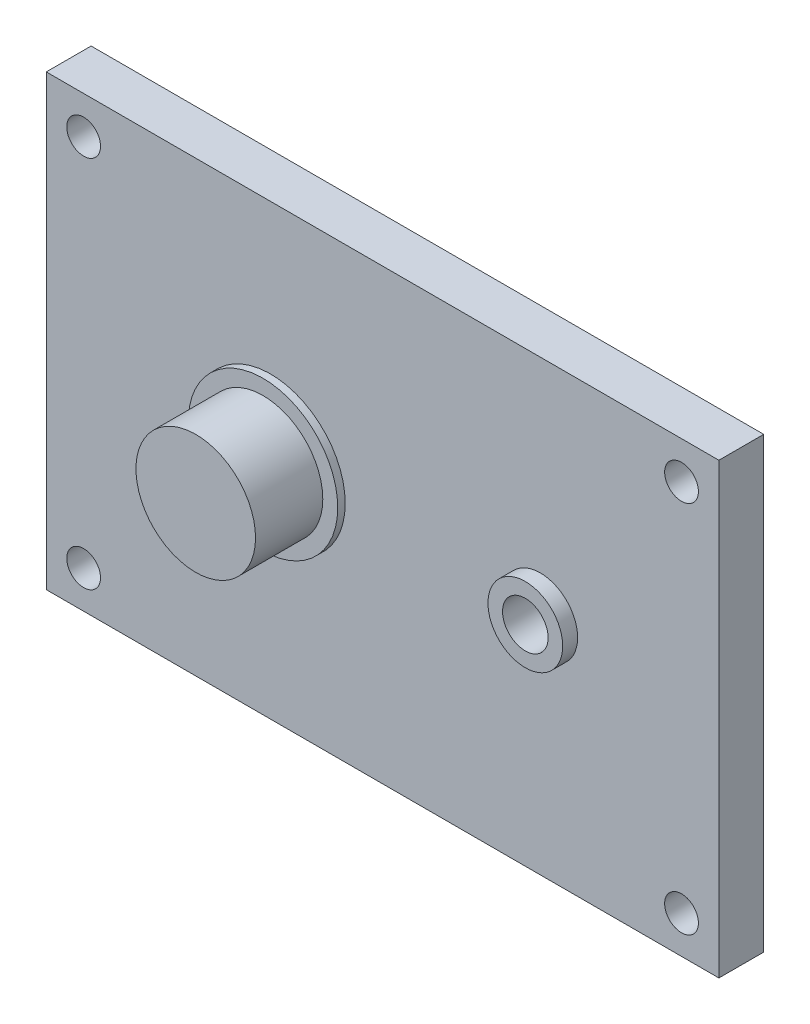
ISO-10303-21;
HEADER;
FILE_DESCRIPTION(('STEP AP214'),'2;1');
FILE_NAME('part.step','',(''),(''),'','','');
FILE_SCHEMA(('AUTOMOTIVE_DESIGN { 1 0 10303 214 1 1 1 1 }'));
ENDSEC;
DATA;
#1=APPLICATION_CONTEXT('core data for automotive mechanical design processes');
#2=APPLICATION_PROTOCOL_DEFINITION('international standard','automotive_design',2000,#1);
#3=PRODUCT_CONTEXT('',#1,'mechanical');
#4=PRODUCT('Part','Part','',(#3));
#5=PRODUCT_RELATED_PRODUCT_CATEGORY('part','',(#4));
#6=PRODUCT_DEFINITION_FORMATION('','',#4);
#7=PRODUCT_DEFINITION_CONTEXT('part definition',#1,'design');
#8=PRODUCT_DEFINITION('design','',#6,#7);
#9=PRODUCT_DEFINITION_SHAPE('','',#8);
#10=(LENGTH_UNIT() NAMED_UNIT(*) SI_UNIT(.MILLI.,.METRE.));
#11=(NAMED_UNIT(*) PLANE_ANGLE_UNIT() SI_UNIT($,.RADIAN.));
#12=(NAMED_UNIT(*) SI_UNIT($,.STERADIAN.) SOLID_ANGLE_UNIT());
#13=UNCERTAINTY_MEASURE_WITH_UNIT(LENGTH_MEASURE(1.E-05),#10,'distance_accuracy_value','');
#14=(GEOMETRIC_REPRESENTATION_CONTEXT(3) GLOBAL_UNCERTAINTY_ASSIGNED_CONTEXT((#13)) GLOBAL_UNIT_ASSIGNED_CONTEXT((#10,
#11,#12)) REPRESENTATION_CONTEXT('',''));
#15=CARTESIAN_POINT('',(0.,0.,0.));
#16=DIRECTION('',(0.,0.,1.));
#17=DIRECTION('',(1.,0.,0.));
#18=AXIS2_PLACEMENT_3D('',#15,#16,#17);
#19=CARTESIAN_POINT('',(0.,0.,3.));
#20=DIRECTION('',(0.,0.,1.));
#21=DIRECTION('',(1.,0.,0.));
#22=AXIS2_PLACEMENT_3D('',#19,#20,#21);
#23=PLANE('',#22);
#24=CARTESIAN_POINT('',(0.,0.,3.));
#25=DIRECTION('',(0.,0.,1.));
#26=DIRECTION('',(1.,0.,0.));
#27=AXIS2_PLACEMENT_3D('',#24,#25,#26);
#28=CIRCLE('',#27,5.);
#29=CARTESIAN_POINT('',(5.,0.,3.));
#30=VERTEX_POINT('',#29);
#31=EDGE_CURVE('E124',#30,#30,#28,.T.);
#32=ORIENTED_EDGE('',*,*,#31,.F.);
#33=EDGE_LOOP('',(#32));
#34=FACE_BOUND('',#33,.T.);
#35=DIRECTION('',(0.,-1.,0.));
#36=VECTOR('',#35,1.);
#37=CARTESIAN_POINT('',(-15.,15.,3.));
#38=LINE('',#37,#36);
#39=CARTESIAN_POINT('',(-15.,15.,3.));
#40=VERTEX_POINT('',#39);
#41=CARTESIAN_POINT('',(-15.,-15.,3.));
#42=VERTEX_POINT('',#41);
#43=EDGE_CURVE('E91',#40,#42,#38,.T.);
#44=ORIENTED_EDGE('',*,*,#43,.T.);
#45=DIRECTION('',(1.,0.,0.));
#46=VECTOR('',#45,1.);
#47=CARTESIAN_POINT('',(-15.,-15.,3.));
#48=LINE('',#47,#46);
#49=CARTESIAN_POINT('',(30.,-15.,3.));
#50=VERTEX_POINT('',#49);
#51=EDGE_CURVE('E86',#42,#50,#48,.T.);
#52=ORIENTED_EDGE('',*,*,#51,.T.);
#53=DIRECTION('',(0.,1.,0.));
#54=VECTOR('',#53,1.);
#55=CARTESIAN_POINT('',(30.,15.,3.));
#56=LINE('',#55,#54);
#57=CARTESIAN_POINT('',(30.,15.,3.));
#58=VERTEX_POINT('',#57);
#59=EDGE_CURVE('E89',#50,#58,#56,.T.);
#60=ORIENTED_EDGE('',*,*,#59,.T.);
#61=DIRECTION('',(-1.,0.,0.));
#62=VECTOR('',#61,1.);
#63=CARTESIAN_POINT('',(-15.,15.,3.));
#64=LINE('',#63,#62);
#65=EDGE_CURVE('E56',#58,#40,#64,.T.);
#66=ORIENTED_EDGE('',*,*,#65,.T.);
#67=EDGE_LOOP('',(#44,#52,#60,#66));
#68=FACE_BOUND('',#67,.T.);
#69=CARTESIAN_POINT('',(27.5,12.5,3.));
#70=DIRECTION('',(0.,0.,1.));
#71=DIRECTION('',(1.,0.,0.));
#72=AXIS2_PLACEMENT_3D('',#69,#70,#71);
#73=CIRCLE('',#72,1.1303);
#74=CARTESIAN_POINT('',(28.6303,12.5,3.));
#75=VERTEX_POINT('',#74);
#76=EDGE_CURVE('E135',#75,#75,#73,.T.);
#77=ORIENTED_EDGE('',*,*,#76,.F.);
#78=EDGE_LOOP('',(#77));
#79=FACE_BOUND('',#78,.T.);
#80=CARTESIAN_POINT('',(27.5,-12.5,3.));
#81=DIRECTION('',(0.,0.,1.));
#82=DIRECTION('',(1.,0.,0.));
#83=AXIS2_PLACEMENT_3D('',#80,#81,#82);
#84=CIRCLE('',#83,1.1303);
#85=CARTESIAN_POINT('',(28.6303,-12.5,3.));
#86=VERTEX_POINT('',#85);
#87=EDGE_CURVE('E141',#86,#86,#84,.T.);
#88=ORIENTED_EDGE('',*,*,#87,.F.);
#89=EDGE_LOOP('',(#88));
#90=FACE_BOUND('',#89,.T.);
#91=CARTESIAN_POINT('',(-12.5,-12.5,3.));
#92=DIRECTION('',(0.,0.,1.));
#93=DIRECTION('',(1.,0.,0.));
#94=AXIS2_PLACEMENT_3D('',#91,#92,#93);
#95=CIRCLE('',#94,1.1303);
#96=CARTESIAN_POINT('',(-11.3697,-12.5,3.));
#97=VERTEX_POINT('',#96);
#98=EDGE_CURVE('E147',#97,#97,#95,.T.);
#99=ORIENTED_EDGE('',*,*,#98,.F.);
#100=EDGE_LOOP('',(#99));
#101=FACE_BOUND('',#100,.T.);
#102=CARTESIAN_POINT('',(-12.5,12.5,3.));
#103=DIRECTION('',(0.,0.,1.));
#104=DIRECTION('',(1.,0.,0.));
#105=AXIS2_PLACEMENT_3D('',#102,#103,#104);
#106=CIRCLE('',#105,1.1303);
#107=CARTESIAN_POINT('',(-11.3697,12.5,3.));
#108=VERTEX_POINT('',#107);
#109=EDGE_CURVE('E153',#108,#108,#106,.T.);
#110=ORIENTED_EDGE('',*,*,#109,.F.);
#111=EDGE_LOOP('',(#110));
#112=FACE_BOUND('',#111,.T.);
#113=CARTESIAN_POINT('',(18.050000068,0.,3.));
#114=DIRECTION('',(0.,0.,1.));
#115=DIRECTION('',(1.,0.,0.));
#116=AXIS2_PLACEMENT_3D('',#113,#114,#115);
#117=CIRCLE('',#116,2.5);
#118=CARTESIAN_POINT('',(20.550000068,0.,3.));
#119=VERTEX_POINT('',#118);
#120=EDGE_CURVE('E157',#119,#119,#117,.T.);
#121=ORIENTED_EDGE('',*,*,#120,.F.);
#122=EDGE_LOOP('',(#121));
#123=FACE_BOUND('',#122,.T.);
#124=ADVANCED_FACE('F39',(#34,#68,#79,#90,#101,#112,#123),#23,.T.);
#125=CARTESIAN_POINT('',(0.,0.,0.));
#126=DIRECTION('',(0.,0.,1.));
#127=DIRECTION('',(1.,0.,0.));
#128=AXIS2_PLACEMENT_3D('',#125,#126,#127);
#129=PLANE('',#128);
#130=CARTESIAN_POINT('',(-12.5,12.5,0.));
#131=DIRECTION('',(0.,0.,1.));
#132=DIRECTION('',(1.,0.,0.));
#133=AXIS2_PLACEMENT_3D('',#130,#131,#132);
#134=CIRCLE('',#133,1.1303);
#135=CARTESIAN_POINT('',(-11.3697,12.5,0.));
#136=VERTEX_POINT('',#135);
#137=EDGE_CURVE('E150',#136,#136,#134,.T.);
#138=ORIENTED_EDGE('',*,*,#137,.T.);
#139=EDGE_LOOP('',(#138));
#140=FACE_BOUND('',#139,.T.);
#141=CARTESIAN_POINT('',(-12.5,-12.5,0.));
#142=DIRECTION('',(0.,0.,1.));
#143=DIRECTION('',(1.,0.,0.));
#144=AXIS2_PLACEMENT_3D('',#141,#142,#143);
#145=CIRCLE('',#144,1.1303);
#146=CARTESIAN_POINT('',(-11.3697,-12.5,0.));
#147=VERTEX_POINT('',#146);
#148=EDGE_CURVE('E144',#147,#147,#145,.T.);
#149=ORIENTED_EDGE('',*,*,#148,.T.);
#150=EDGE_LOOP('',(#149));
#151=FACE_BOUND('',#150,.T.);
#152=CARTESIAN_POINT('',(27.5,-12.5,0.));
#153=DIRECTION('',(0.,0.,1.));
#154=DIRECTION('',(1.,0.,0.));
#155=AXIS2_PLACEMENT_3D('',#152,#153,#154);
#156=CIRCLE('',#155,1.1303);
#157=CARTESIAN_POINT('',(28.6303,-12.5,0.));
#158=VERTEX_POINT('',#157);
#159=EDGE_CURVE('E138',#158,#158,#156,.T.);
#160=ORIENTED_EDGE('',*,*,#159,.T.);
#161=EDGE_LOOP('',(#160));
#162=FACE_BOUND('',#161,.T.);
#163=CARTESIAN_POINT('',(27.5,12.5,0.));
#164=DIRECTION('',(0.,0.,1.));
#165=DIRECTION('',(1.,0.,0.));
#166=AXIS2_PLACEMENT_3D('',#163,#164,#165);
#167=CIRCLE('',#166,1.1303);
#168=CARTESIAN_POINT('',(28.6303,12.5,0.));
#169=VERTEX_POINT('',#168);
#170=EDGE_CURVE('E128',#169,#169,#167,.T.);
#171=ORIENTED_EDGE('',*,*,#170,.T.);
#172=EDGE_LOOP('',(#171));
#173=FACE_BOUND('',#172,.T.);
#174=DIRECTION('',(0.,-1.,0.));
#175=VECTOR('',#174,1.);
#176=CARTESIAN_POINT('',(-15.,15.,0.));
#177=LINE('',#176,#175);
#178=CARTESIAN_POINT('',(-15.,15.,0.));
#179=VERTEX_POINT('',#178);
#180=CARTESIAN_POINT('',(-15.,-15.,0.));
#181=VERTEX_POINT('',#180);
#182=EDGE_CURVE('E103',#179,#181,#177,.T.);
#183=ORIENTED_EDGE('',*,*,#182,.F.);
#184=DIRECTION('',(-1.,0.,0.));
#185=VECTOR('',#184,1.);
#186=CARTESIAN_POINT('',(-15.,15.,0.));
#187=LINE('',#186,#185);
#188=CARTESIAN_POINT('',(30.,15.,0.));
#189=VERTEX_POINT('',#188);
#190=EDGE_CURVE('E79',#189,#179,#187,.T.);
#191=ORIENTED_EDGE('',*,*,#190,.F.);
#192=DIRECTION('',(0.,1.,0.));
#193=VECTOR('',#192,1.);
#194=CARTESIAN_POINT('',(30.,15.,0.));
#195=LINE('',#194,#193);
#196=CARTESIAN_POINT('',(30.,-15.,0.));
#197=VERTEX_POINT('',#196);
#198=EDGE_CURVE('E73',#197,#189,#195,.T.);
#199=ORIENTED_EDGE('',*,*,#198,.F.);
#200=DIRECTION('',(1.,0.,0.));
#201=VECTOR('',#200,1.);
#202=CARTESIAN_POINT('',(-15.,-15.,0.));
#203=LINE('',#202,#201);
#204=EDGE_CURVE('E95',#181,#197,#203,.T.);
#205=ORIENTED_EDGE('',*,*,#204,.F.);
#206=EDGE_LOOP('',(#183,#191,#199,#205));
#207=FACE_BOUND('',#206,.T.);
#208=CARTESIAN_POINT('',(18.050000068,0.,0.));
#209=DIRECTION('',(0.,0.,1.));
#210=DIRECTION('',(1.,0.,0.));
#211=AXIS2_PLACEMENT_3D('',#208,#209,#210);
#212=CIRCLE('',#211,1.525);
#213=CARTESIAN_POINT('',(19.575000068,0.,0.));
#214=VERTEX_POINT('',#213);
#215=EDGE_CURVE('E106',#214,#214,#212,.T.);
#216=ORIENTED_EDGE('',*,*,#215,.T.);
#217=EDGE_LOOP('',(#216));
#218=FACE_BOUND('',#217,.T.);
#219=ADVANCED_FACE('F114',(#140,#151,#162,#173,#207,#218),#129,.F.);
#220=CARTESIAN_POINT('',(-15.,15.,3.));
#221=DIRECTION('',(1.,0.,0.));
#222=DIRECTION('',(0.,1.,0.));
#223=AXIS2_PLACEMENT_3D('',#220,#221,#222);
#224=PLANE('',#223);
#225=ORIENTED_EDGE('',*,*,#182,.T.);
#226=DIRECTION('',(0.,0.,-1.));
#227=VECTOR('',#226,1.);
#228=CARTESIAN_POINT('',(-15.,-15.,3.));
#229=LINE('',#228,#227);
#230=EDGE_CURVE('E11',#42,#181,#229,.T.);
#231=ORIENTED_EDGE('',*,*,#230,.F.);
#232=ORIENTED_EDGE('',*,*,#43,.F.);
#233=DIRECTION('',(0.,0.,-1.));
#234=VECTOR('',#233,1.);
#235=CARTESIAN_POINT('',(-15.,15.,3.));
#236=LINE('',#235,#234);
#237=EDGE_CURVE('E99',#40,#179,#236,.T.);
#238=ORIENTED_EDGE('',*,*,#237,.T.);
#239=EDGE_LOOP('',(#225,#231,#232,#238));
#240=FACE_BOUND('',#239,.T.);
#241=ADVANCED_FACE('F41',(#240),#224,.F.);
#242=CARTESIAN_POINT('',(-15.,-15.,3.));
#243=DIRECTION('',(0.,1.,0.));
#244=DIRECTION('',(-1.,0.,0.));
#245=AXIS2_PLACEMENT_3D('',#242,#243,#244);
#246=PLANE('',#245);
#247=ORIENTED_EDGE('',*,*,#204,.T.);
#248=DIRECTION('',(0.,0.,-1.));
#249=VECTOR('',#248,1.);
#250=CARTESIAN_POINT('',(30.,-15.,3.));
#251=LINE('',#250,#249);
#252=EDGE_CURVE('E48',#50,#197,#251,.T.);
#253=ORIENTED_EDGE('',*,*,#252,.F.);
#254=ORIENTED_EDGE('',*,*,#51,.F.);
#255=ORIENTED_EDGE('',*,*,#230,.T.);
#256=EDGE_LOOP('',(#247,#253,#254,#255));
#257=FACE_BOUND('',#256,.T.);
#258=ADVANCED_FACE('F94',(#257),#246,.F.);
#259=CARTESIAN_POINT('',(30.,15.,3.));
#260=DIRECTION('',(-1.,0.,0.));
#261=DIRECTION('',(0.,-1.,0.));
#262=AXIS2_PLACEMENT_3D('',#259,#260,#261);
#263=PLANE('',#262);
#264=ORIENTED_EDGE('',*,*,#198,.T.);
#265=DIRECTION('',(0.,0.,-1.));
#266=VECTOR('',#265,1.);
#267=CARTESIAN_POINT('',(30.,15.,3.));
#268=LINE('',#267,#266);
#269=EDGE_CURVE('E96',#58,#189,#268,.T.);
#270=ORIENTED_EDGE('',*,*,#269,.F.);
#271=ORIENTED_EDGE('',*,*,#59,.F.);
#272=ORIENTED_EDGE('',*,*,#252,.T.);
#273=EDGE_LOOP('',(#264,#270,#271,#272));
#274=FACE_BOUND('',#273,.T.);
#275=ADVANCED_FACE('F97',(#274),#263,.F.);
#276=CARTESIAN_POINT('',(-15.,15.,3.));
#277=DIRECTION('',(0.,-1.,0.));
#278=DIRECTION('',(0.,0.,-1.));
#279=AXIS2_PLACEMENT_3D('',#276,#277,#278);
#280=PLANE('',#279);
#281=ORIENTED_EDGE('',*,*,#190,.T.);
#282=ORIENTED_EDGE('',*,*,#237,.F.);
#283=ORIENTED_EDGE('',*,*,#65,.F.);
#284=ORIENTED_EDGE('',*,*,#269,.T.);
#285=EDGE_LOOP('',(#281,#282,#283,#284));
#286=FACE_BOUND('',#285,.T.);
#287=ADVANCED_FACE('F111',(#286),#280,.F.);
#288=CARTESIAN_POINT('',(18.050000068,0.,3.));
#289=DIRECTION('',(0.,0.,-1.));
#290=DIRECTION('',(-1.,0.,0.));
#291=AXIS2_PLACEMENT_3D('',#288,#289,#290);
#292=CYLINDRICAL_SURFACE('',#291,1.525);
#293=ORIENTED_EDGE('',*,*,#215,.F.);
#294=EDGE_LOOP('',(#293));
#295=FACE_BOUND('',#294,.T.);
#296=CARTESIAN_POINT('',(18.050000068,0.,4.));
#297=DIRECTION('',(0.,0.,1.));
#298=DIRECTION('',(1.,0.,0.));
#299=AXIS2_PLACEMENT_3D('',#296,#297,#298);
#300=CIRCLE('',#299,1.525);
#301=CARTESIAN_POINT('',(19.575000068,0.,4.));
#302=VERTEX_POINT('',#301);
#303=EDGE_CURVE('E160',#302,#302,#300,.T.);
#304=ORIENTED_EDGE('',*,*,#303,.T.);
#305=EDGE_LOOP('',(#304));
#306=FACE_BOUND('',#305,.T.);
#307=ADVANCED_FACE('F166',(#295,#306),#292,.F.);
#308=CARTESIAN_POINT('',(0.,0.,3.5));
#309=DIRECTION('',(0.,0.,-1.));
#310=DIRECTION('',(-1.,0.,0.));
#311=AXIS2_PLACEMENT_3D('',#308,#309,#310);
#312=CYLINDRICAL_SURFACE('',#311,5.);
#313=CARTESIAN_POINT('',(0.,0.,3.5));
#314=DIRECTION('',(0.,0.,1.));
#315=DIRECTION('',(1.,0.,0.));
#316=AXIS2_PLACEMENT_3D('',#313,#314,#315);
#317=CIRCLE('',#316,5.);
#318=CARTESIAN_POINT('',(5.,0.,3.5));
#319=VERTEX_POINT('',#318);
#320=EDGE_CURVE('E123',#319,#319,#317,.T.);
#321=ORIENTED_EDGE('',*,*,#320,.F.);
#322=EDGE_LOOP('',(#321));
#323=FACE_BOUND('',#322,.T.);
#324=ORIENTED_EDGE('',*,*,#31,.T.);
#325=EDGE_LOOP('',(#324));
#326=FACE_BOUND('',#325,.T.);
#327=ADVANCED_FACE('F262',(#323,#326),#312,.T.);
#328=CARTESIAN_POINT('',(0.,0.,3.5));
#329=DIRECTION('',(0.,0.,1.));
#330=DIRECTION('',(1.,0.,0.));
#331=AXIS2_PLACEMENT_3D('',#328,#329,#330);
#332=PLANE('',#331);
#333=CARTESIAN_POINT('',(0.,0.,3.5));
#334=DIRECTION('',(0.,0.,1.));
#335=DIRECTION('',(1.,0.,0.));
#336=AXIS2_PLACEMENT_3D('',#333,#334,#335);
#337=CIRCLE('',#336,4.);
#338=CARTESIAN_POINT('',(4.,0.,3.5));
#339=VERTEX_POINT('',#338);
#340=EDGE_CURVE('E127',#339,#339,#337,.F.);
#341=ORIENTED_EDGE('',*,*,#340,.T.);
#342=EDGE_LOOP('',(#341));
#343=FACE_BOUND('',#342,.T.);
#344=ORIENTED_EDGE('',*,*,#320,.T.);
#345=EDGE_LOOP('',(#344));
#346=FACE_BOUND('',#345,.T.);
#347=ADVANCED_FACE('F284',(#343,#346),#332,.T.);
#348=CARTESIAN_POINT('',(0.,0.,8.));
#349=DIRECTION('',(0.,0.,1.));
#350=DIRECTION('',(1.,0.,0.));
#351=AXIS2_PLACEMENT_3D('',#348,#349,#350);
#352=PLANE('',#351);
#353=CARTESIAN_POINT('',(0.,0.,8.));
#354=DIRECTION('',(0.,0.,1.));
#355=DIRECTION('',(1.,0.,0.));
#356=AXIS2_PLACEMENT_3D('',#353,#354,#355);
#357=CIRCLE('',#356,4.);
#358=CARTESIAN_POINT('',(4.,0.,8.));
#359=VERTEX_POINT('',#358);
#360=EDGE_CURVE('E120',#359,#359,#357,.T.);
#361=ORIENTED_EDGE('',*,*,#360,.T.);
#362=EDGE_LOOP('',(#361));
#363=FACE_BOUND('',#362,.T.);
#364=ADVANCED_FACE('F292',(#363),#352,.T.);
#365=CARTESIAN_POINT('',(0.,0.,8.));
#366=DIRECTION('',(0.,0.,-1.));
#367=DIRECTION('',(-1.,0.,0.));
#368=AXIS2_PLACEMENT_3D('',#365,#366,#367);
#369=CYLINDRICAL_SURFACE('',#368,4.);
#370=ORIENTED_EDGE('',*,*,#340,.F.);
#371=EDGE_LOOP('',(#370));
#372=FACE_BOUND('',#371,.T.);
#373=ORIENTED_EDGE('',*,*,#360,.F.);
#374=EDGE_LOOP('',(#373));
#375=FACE_BOUND('',#374,.T.);
#376=ADVANCED_FACE('F214',(#372,#375),#369,.T.);
#377=CARTESIAN_POINT('',(27.5,12.5,3.));
#378=DIRECTION('',(0.,0.,1.));
#379=DIRECTION('',(1.,0.,0.));
#380=AXIS2_PLACEMENT_3D('',#377,#378,#379);
#381=CYLINDRICAL_SURFACE('',#380,1.1303);
#382=ORIENTED_EDGE('',*,*,#170,.F.);
#383=EDGE_LOOP('',(#382));
#384=FACE_BOUND('',#383,.T.);
#385=ORIENTED_EDGE('',*,*,#76,.T.);
#386=EDGE_LOOP('',(#385));
#387=FACE_BOUND('',#386,.T.);
#388=ADVANCED_FACE('F219',(#384,#387),#381,.F.);
#389=CARTESIAN_POINT('',(27.5,-12.5,3.));
#390=DIRECTION('',(0.,0.,1.));
#391=DIRECTION('',(1.,0.,0.));
#392=AXIS2_PLACEMENT_3D('',#389,#390,#391);
#393=CYLINDRICAL_SURFACE('',#392,1.1303);
#394=ORIENTED_EDGE('',*,*,#159,.F.);
#395=EDGE_LOOP('',(#394));
#396=FACE_BOUND('',#395,.T.);
#397=ORIENTED_EDGE('',*,*,#87,.T.);
#398=EDGE_LOOP('',(#397));
#399=FACE_BOUND('',#398,.T.);
#400=ADVANCED_FACE('F224',(#396,#399),#393,.F.);
#401=CARTESIAN_POINT('',(-12.5,-12.5,3.));
#402=DIRECTION('',(0.,0.,1.));
#403=DIRECTION('',(1.,0.,0.));
#404=AXIS2_PLACEMENT_3D('',#401,#402,#403);
#405=CYLINDRICAL_SURFACE('',#404,1.1303);
#406=ORIENTED_EDGE('',*,*,#148,.F.);
#407=EDGE_LOOP('',(#406));
#408=FACE_BOUND('',#407,.T.);
#409=ORIENTED_EDGE('',*,*,#98,.T.);
#410=EDGE_LOOP('',(#409));
#411=FACE_BOUND('',#410,.T.);
#412=ADVANCED_FACE('F180',(#408,#411),#405,.F.);
#413=CARTESIAN_POINT('',(-12.5,12.5,3.));
#414=DIRECTION('',(0.,0.,1.));
#415=DIRECTION('',(1.,0.,0.));
#416=AXIS2_PLACEMENT_3D('',#413,#414,#415);
#417=CYLINDRICAL_SURFACE('',#416,1.1303);
#418=ORIENTED_EDGE('',*,*,#137,.F.);
#419=EDGE_LOOP('',(#418));
#420=FACE_BOUND('',#419,.T.);
#421=ORIENTED_EDGE('',*,*,#109,.T.);
#422=EDGE_LOOP('',(#421));
#423=FACE_BOUND('',#422,.T.);
#424=ADVANCED_FACE('F171',(#420,#423),#417,.F.);
#425=CARTESIAN_POINT('',(18.050000068,0.,4.));
#426=DIRECTION('',(0.,0.,1.));
#427=DIRECTION('',(1.,0.,0.));
#428=AXIS2_PLACEMENT_3D('',#425,#426,#427);
#429=PLANE('',#428);
#430=CARTESIAN_POINT('',(18.050000068,0.,4.));
#431=DIRECTION('',(0.,0.,1.));
#432=DIRECTION('',(1.,0.,0.));
#433=AXIS2_PLACEMENT_3D('',#430,#431,#432);
#434=CIRCLE('',#433,2.5);
#435=CARTESIAN_POINT('',(20.550000068,0.,4.));
#436=VERTEX_POINT('',#435);
#437=EDGE_CURVE('E156',#436,#436,#434,.T.);
#438=ORIENTED_EDGE('',*,*,#437,.T.);
#439=EDGE_LOOP('',(#438));
#440=FACE_BOUND('',#439,.T.);
#441=ORIENTED_EDGE('',*,*,#303,.F.);
#442=EDGE_LOOP('',(#441));
#443=FACE_BOUND('',#442,.T.);
#444=ADVANCED_FACE('F168',(#440,#443),#429,.T.);
#445=CARTESIAN_POINT('',(18.050000068,0.,4.));
#446=DIRECTION('',(0.,0.,-1.));
#447=DIRECTION('',(-1.,0.,0.));
#448=AXIS2_PLACEMENT_3D('',#445,#446,#447);
#449=CYLINDRICAL_SURFACE('',#448,2.5);
#450=ORIENTED_EDGE('',*,*,#437,.F.);
#451=EDGE_LOOP('',(#450));
#452=FACE_BOUND('',#451,.T.);
#453=ORIENTED_EDGE('',*,*,#120,.T.);
#454=EDGE_LOOP('',(#453));
#455=FACE_BOUND('',#454,.T.);
#456=ADVANCED_FACE('F170',(#452,#455),#449,.T.);
#457=CLOSED_SHELL('',(#124,#219,#241,#258,#275,#287,#307,#327,#347,#364,#376,#388,#400,#412,
#424,#444,#456));
#458=MANIFOLD_SOLID_BREP('B2',#457);
#459=ADVANCED_BREP_SHAPE_REPRESENTATION('',(#18,#458),#14);
#460=SHAPE_DEFINITION_REPRESENTATION(#9,#459);
ENDSEC;
END-ISO-10303-21;
